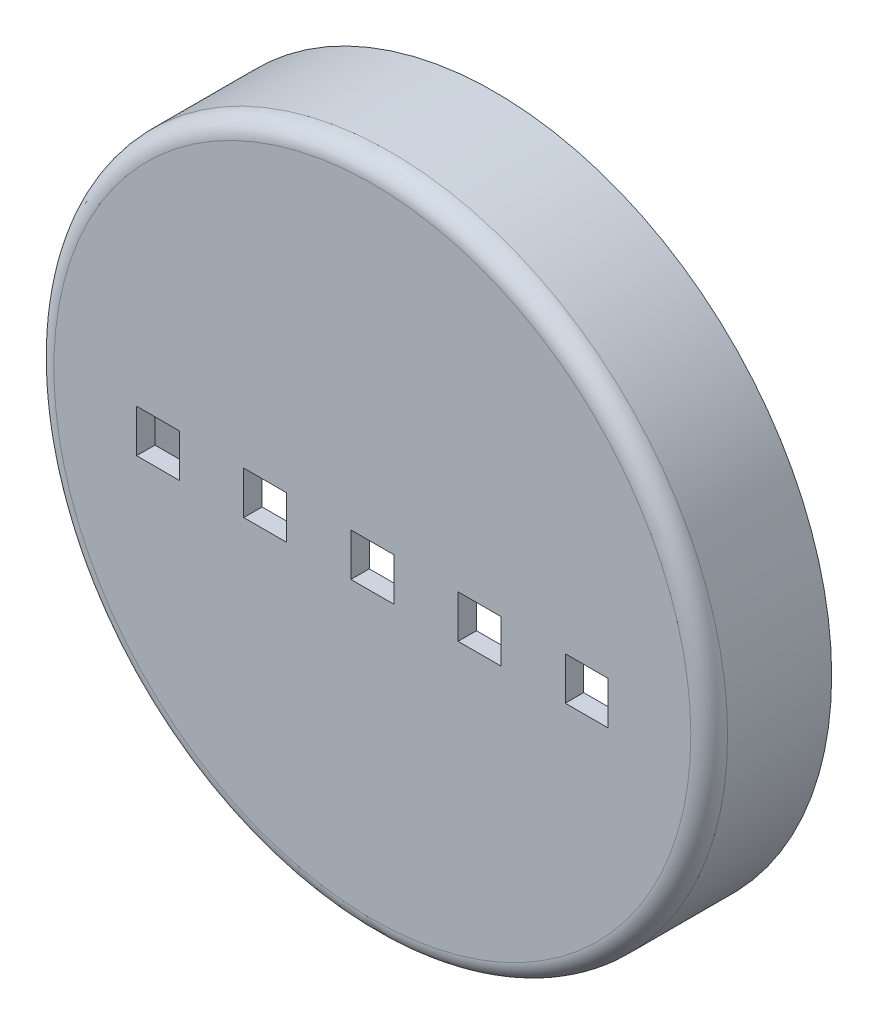
ISO-10303-21;
HEADER;
FILE_DESCRIPTION(('STEP AP214'),'2;1');
FILE_NAME('part.step','',(''),(''),'','','');
FILE_SCHEMA(('AUTOMOTIVE_DESIGN { 1 0 10303 214 1 1 1 1 }'));
ENDSEC;
DATA;
#1=APPLICATION_CONTEXT('core data for automotive mechanical design processes');
#2=APPLICATION_PROTOCOL_DEFINITION('international standard','automotive_design',2000,#1);
#3=PRODUCT_CONTEXT('',#1,'mechanical');
#4=PRODUCT('Part','Part','',(#3));
#5=PRODUCT_RELATED_PRODUCT_CATEGORY('part','',(#4));
#6=PRODUCT_DEFINITION_FORMATION('','',#4);
#7=PRODUCT_DEFINITION_CONTEXT('part definition',#1,'design');
#8=PRODUCT_DEFINITION('design','',#6,#7);
#9=PRODUCT_DEFINITION_SHAPE('','',#8);
#10=(LENGTH_UNIT() NAMED_UNIT(*) SI_UNIT(.MILLI.,.METRE.));
#11=(NAMED_UNIT(*) PLANE_ANGLE_UNIT() SI_UNIT($,.RADIAN.));
#12=(NAMED_UNIT(*) SI_UNIT($,.STERADIAN.) SOLID_ANGLE_UNIT());
#13=UNCERTAINTY_MEASURE_WITH_UNIT(LENGTH_MEASURE(1.E-05),#10,'distance_accuracy_value','');
#14=(GEOMETRIC_REPRESENTATION_CONTEXT(3) GLOBAL_UNCERTAINTY_ASSIGNED_CONTEXT((#13)) GLOBAL_UNIT_ASSIGNED_CONTEXT((#10,
#11,#12)) REPRESENTATION_CONTEXT('',''));
#15=CARTESIAN_POINT('',(0.,0.,0.));
#16=DIRECTION('',(0.,0.,1.));
#17=DIRECTION('',(1.,0.,0.));
#18=AXIS2_PLACEMENT_3D('',#15,#16,#17);
#19=CARTESIAN_POINT('',(328.389379834326,629.271631435778,20.));
#20=DIRECTION('',(0.,0.,1.));
#21=DIRECTION('',(1.,0.,0.));
#22=AXIS2_PLACEMENT_3D('',#19,#20,#21);
#23=PLANE('',#22);
#24=CARTESIAN_POINT('',(328.389379834326,629.271631435778,20.));
#25=DIRECTION('',(0.,0.,1.));
#26=DIRECTION('',(1.,0.,0.));
#27=AXIS2_PLACEMENT_3D('',#24,#25,#26);
#28=CIRCLE('',#27,51.9999999999999);
#29=CARTESIAN_POINT('',(380.389379834326,629.271631435778,20.));
#30=VERTEX_POINT('',#29);
#31=EDGE_CURVE('E72',#30,#30,#28,.T.);
#32=ORIENTED_EDGE('',*,*,#31,.T.);
#33=EDGE_LOOP('',(#32));
#34=FACE_BOUND('',#33,.T.);
#35=DIRECTION('',(0.,1.,0.));
#36=VECTOR('',#35,1.);
#37=CARTESIAN_POINT('',(307.389379834326,629.271631435778,20.));
#38=LINE('',#37,#36);
#39=CARTESIAN_POINT('',(307.389379834326,623.576422512426,20.));
#40=VERTEX_POINT('',#39);
#41=CARTESIAN_POINT('',(307.389379834326,630.576422512426,20.));
#42=VERTEX_POINT('',#41);
#43=EDGE_CURVE('E362',#40,#42,#38,.T.);
#44=ORIENTED_EDGE('',*,*,#43,.T.);
#45=DIRECTION('',(1.,0.,0.));
#46=VECTOR('',#45,1.);
#47=CARTESIAN_POINT('',(328.389379834326,630.576422512426,20.));
#48=LINE('',#47,#46);
#49=CARTESIAN_POINT('',(314.389379834326,630.576422512426,20.));
#50=VERTEX_POINT('',#49);
#51=EDGE_CURVE('E355',#42,#50,#48,.T.);
#52=ORIENTED_EDGE('',*,*,#51,.T.);
#53=DIRECTION('',(0.,1.,0.));
#54=VECTOR('',#53,1.);
#55=CARTESIAN_POINT('',(314.389379834326,629.271631435778,20.));
#56=LINE('',#55,#54);
#57=CARTESIAN_POINT('',(314.389379834326,623.576422512426,20.));
#58=VERTEX_POINT('',#57);
#59=EDGE_CURVE('E359',#58,#50,#56,.T.);
#60=ORIENTED_EDGE('',*,*,#59,.F.);
#61=DIRECTION('',(1.,0.,0.));
#62=VECTOR('',#61,1.);
#63=CARTESIAN_POINT('',(328.389379834326,623.576422512426,20.));
#64=LINE('',#63,#62);
#65=EDGE_CURVE('E234',#40,#58,#64,.T.);
#66=ORIENTED_EDGE('',*,*,#65,.F.);
#67=EDGE_LOOP('',(#44,#52,#60,#66));
#68=FACE_BOUND('',#67,.T.);
#69=DIRECTION('',(1.,0.,0.));
#70=VECTOR('',#69,1.);
#71=CARTESIAN_POINT('',(328.389379834326,623.576422512426,20.));
#72=LINE('',#71,#70);
#73=CARTESIAN_POINT('',(289.889379834326,623.576422512426,20.));
#74=VERTEX_POINT('',#73);
#75=CARTESIAN_POINT('',(296.889379834326,623.576422512426,20.));
#76=VERTEX_POINT('',#75);
#77=EDGE_CURVE('E374',#74,#76,#72,.T.);
#78=ORIENTED_EDGE('',*,*,#77,.F.);
#79=DIRECTION('',(0.,1.,0.));
#80=VECTOR('',#79,1.);
#81=CARTESIAN_POINT('',(289.889379834326,629.271631435778,20.));
#82=LINE('',#81,#80);
#83=CARTESIAN_POINT('',(289.889379834326,630.576422512426,20.));
#84=VERTEX_POINT('',#83);
#85=EDGE_CURVE('E377',#74,#84,#82,.T.);
#86=ORIENTED_EDGE('',*,*,#85,.T.);
#87=DIRECTION('',(1.,0.,0.));
#88=VECTOR('',#87,1.);
#89=CARTESIAN_POINT('',(328.389379834326,630.576422512426,20.));
#90=LINE('',#89,#88);
#91=CARTESIAN_POINT('',(296.889379834326,630.576422512426,20.));
#92=VERTEX_POINT('',#91);
#93=EDGE_CURVE('E366',#84,#92,#90,.T.);
#94=ORIENTED_EDGE('',*,*,#93,.T.);
#95=DIRECTION('',(0.,1.,0.));
#96=VECTOR('',#95,1.);
#97=CARTESIAN_POINT('',(296.889379834326,629.271631435778,20.));
#98=LINE('',#97,#96);
#99=EDGE_CURVE('E370',#76,#92,#98,.T.);
#100=ORIENTED_EDGE('',*,*,#99,.F.);
#101=EDGE_LOOP('',(#78,#86,#94,#100));
#102=FACE_BOUND('',#101,.T.);
#103=DIRECTION('',(1.,0.,0.));
#104=VECTOR('',#103,1.);
#105=CARTESIAN_POINT('',(328.389379834326,623.576422512427,20.));
#106=LINE('',#105,#104);
#107=CARTESIAN_POINT('',(324.889379834326,623.576422512427,20.));
#108=VERTEX_POINT('',#107);
#109=CARTESIAN_POINT('',(331.889379834326,623.576422512427,20.));
#110=VERTEX_POINT('',#109);
#111=EDGE_CURVE('E389',#108,#110,#106,.T.);
#112=ORIENTED_EDGE('',*,*,#111,.F.);
#113=DIRECTION('',(0.,1.,0.));
#114=VECTOR('',#113,1.);
#115=CARTESIAN_POINT('',(324.889379834326,629.271631435778,20.));
#116=LINE('',#115,#114);
#117=CARTESIAN_POINT('',(324.889379834326,630.576422512427,20.));
#118=VERTEX_POINT('',#117);
#119=EDGE_CURVE('E392',#108,#118,#116,.T.);
#120=ORIENTED_EDGE('',*,*,#119,.T.);
#121=DIRECTION('',(1.,0.,0.));
#122=VECTOR('',#121,1.);
#123=CARTESIAN_POINT('',(328.389379834326,630.576422512427,20.));
#124=LINE('',#123,#122);
#125=CARTESIAN_POINT('',(331.889379834326,630.576422512427,20.));
#126=VERTEX_POINT('',#125);
#127=EDGE_CURVE('E381',#118,#126,#124,.T.);
#128=ORIENTED_EDGE('',*,*,#127,.T.);
#129=DIRECTION('',(0.,1.,0.));
#130=VECTOR('',#129,1.);
#131=CARTESIAN_POINT('',(331.889379834326,629.271631435778,20.));
#132=LINE('',#131,#130);
#133=EDGE_CURVE('E385',#110,#126,#132,.T.);
#134=ORIENTED_EDGE('',*,*,#133,.F.);
#135=EDGE_LOOP('',(#112,#120,#128,#134));
#136=FACE_BOUND('',#135,.T.);
#137=DIRECTION('',(1.,0.,0.));
#138=VECTOR('',#137,1.);
#139=CARTESIAN_POINT('',(328.389379834326,623.576422512427,20.));
#140=LINE('',#139,#138);
#141=CARTESIAN_POINT('',(342.389379834326,623.576422512427,20.));
#142=VERTEX_POINT('',#141);
#143=CARTESIAN_POINT('',(349.389379834326,623.576422512427,20.));
#144=VERTEX_POINT('',#143);
#145=EDGE_CURVE('E403',#142,#144,#140,.T.);
#146=ORIENTED_EDGE('',*,*,#145,.F.);
#147=DIRECTION('',(0.,1.,0.));
#148=VECTOR('',#147,1.);
#149=CARTESIAN_POINT('',(342.389379834326,629.271631435778,20.));
#150=LINE('',#149,#148);
#151=CARTESIAN_POINT('',(342.389379834326,630.576422512427,20.));
#152=VERTEX_POINT('',#151);
#153=EDGE_CURVE('E406',#142,#152,#150,.T.);
#154=ORIENTED_EDGE('',*,*,#153,.T.);
#155=DIRECTION('',(1.,0.,0.));
#156=VECTOR('',#155,1.);
#157=CARTESIAN_POINT('',(328.389379834326,630.576422512427,20.));
#158=LINE('',#157,#156);
#159=CARTESIAN_POINT('',(349.389379834326,630.576422512427,20.));
#160=VERTEX_POINT('',#159);
#161=EDGE_CURVE('E396',#152,#160,#158,.T.);
#162=ORIENTED_EDGE('',*,*,#161,.T.);
#163=DIRECTION('',(0.,1.,0.));
#164=VECTOR('',#163,1.);
#165=CARTESIAN_POINT('',(349.389379834326,629.271631435778,20.));
#166=LINE('',#165,#164);
#167=EDGE_CURVE('E400',#144,#160,#166,.T.);
#168=ORIENTED_EDGE('',*,*,#167,.F.);
#169=EDGE_LOOP('',(#146,#154,#162,#168));
#170=FACE_BOUND('',#169,.T.);
#171=DIRECTION('',(1.,0.,0.));
#172=VECTOR('',#171,1.);
#173=CARTESIAN_POINT('',(328.389379834326,623.576422512426,20.));
#174=LINE('',#173,#172);
#175=CARTESIAN_POINT('',(359.889379834326,623.576422512426,20.));
#176=VERTEX_POINT('',#175);
#177=CARTESIAN_POINT('',(366.889379834326,623.576422512426,20.));
#178=VERTEX_POINT('',#177);
#179=EDGE_CURVE('E415',#176,#178,#174,.T.);
#180=ORIENTED_EDGE('',*,*,#179,.F.);
#181=DIRECTION('',(0.,1.,0.));
#182=VECTOR('',#181,1.);
#183=CARTESIAN_POINT('',(359.889379834326,629.271631435778,20.));
#184=LINE('',#183,#182);
#185=CARTESIAN_POINT('',(359.889379834326,630.576422512426,20.));
#186=VERTEX_POINT('',#185);
#187=EDGE_CURVE('E418',#176,#186,#184,.T.);
#188=ORIENTED_EDGE('',*,*,#187,.T.);
#189=DIRECTION('',(1.,0.,0.));
#190=VECTOR('',#189,1.);
#191=CARTESIAN_POINT('',(328.389379834326,630.576422512426,20.));
#192=LINE('',#191,#190);
#193=CARTESIAN_POINT('',(366.889379834326,630.576422512426,20.));
#194=VERTEX_POINT('',#193);
#195=EDGE_CURVE('E410',#186,#194,#192,.T.);
#196=ORIENTED_EDGE('',*,*,#195,.T.);
#197=DIRECTION('',(0.,1.,0.));
#198=VECTOR('',#197,1.);
#199=CARTESIAN_POINT('',(366.889379834326,629.271631435778,20.));
#200=LINE('',#199,#198);
#201=EDGE_CURVE('E206',#178,#194,#200,.T.);
#202=ORIENTED_EDGE('',*,*,#201,.F.);
#203=EDGE_LOOP('',(#180,#188,#196,#202));
#204=FACE_BOUND('',#203,.T.);
#205=ADVANCED_FACE('F63',(#34,#68,#102,#136,#170,#204),#23,.T.);
#206=CARTESIAN_POINT('',(328.628637891029,629.38432064902,17.));
#207=DIRECTION('',(0.,0.,-1.));
#208=DIRECTION('',(-1.,0.,0.));
#209=AXIS2_PLACEMENT_3D('',#206,#207,#208);
#210=PLANE('',#209);
#211=CARTESIAN_POINT('',(282.389379834326,627.076422512427,17.));
#212=DIRECTION('',(0.,0.,-1.));
#213=DIRECTION('',(-1.,0.,0.));
#214=AXIS2_PLACEMENT_3D('',#211,#212,#213);
#215=CIRCLE('',#214,1.50000000000002);
#216=CARTESIAN_POINT('',(280.889379834326,627.076422512427,17.));
#217=VERTEX_POINT('',#216);
#218=EDGE_CURVE('E423',#217,#217,#215,.T.);
#219=ORIENTED_EDGE('',*,*,#218,.F.);
#220=EDGE_LOOP('',(#219));
#221=FACE_BOUND('',#220,.T.);
#222=CARTESIAN_POINT('',(374.389379834326,627.076422512427,17.));
#223=DIRECTION('',(0.,0.,-1.));
#224=DIRECTION('',(-1.,0.,0.));
#225=AXIS2_PLACEMENT_3D('',#222,#223,#224);
#226=CIRCLE('',#225,1.50000000000002);
#227=CARTESIAN_POINT('',(372.889379834326,627.076422512427,17.));
#228=VERTEX_POINT('',#227);
#229=EDGE_CURVE('E427',#228,#228,#226,.T.);
#230=ORIENTED_EDGE('',*,*,#229,.F.);
#231=EDGE_LOOP('',(#230));
#232=FACE_BOUND('',#231,.T.);
#233=CARTESIAN_POINT('',(328.628637891029,629.38432064902,17.));
#234=DIRECTION('',(0.,0.,-1.));
#235=DIRECTION('',(-1.,0.,0.));
#236=AXIS2_PLACEMENT_3D('',#233,#234,#235);
#237=CIRCLE('',#236,51.);
#238=CARTESIAN_POINT('',(277.628637891029,629.38432064902,17.));
#239=VERTEX_POINT('',#238);
#240=EDGE_CURVE('E439',#239,#239,#237,.T.);
#241=ORIENTED_EDGE('',*,*,#240,.T.);
#242=EDGE_LOOP('',(#241));
#243=FACE_BOUND('',#242,.T.);
#244=DIRECTION('',(0.,-1.,0.));
#245=VECTOR('',#244,1.);
#246=CARTESIAN_POINT('',(314.389379834326,630.576422512426,17.));
#247=LINE('',#246,#245);
#248=CARTESIAN_POINT('',(314.389379834326,630.576422512426,17.));
#249=VERTEX_POINT('',#248);
#250=CARTESIAN_POINT('',(314.389379834326,623.576422512426,17.));
#251=VERTEX_POINT('',#250);
#252=EDGE_CURVE('E311',#249,#251,#247,.T.);
#253=ORIENTED_EDGE('',*,*,#252,.F.);
#254=DIRECTION('',(-1.,0.,0.));
#255=VECTOR('',#254,1.);
#256=CARTESIAN_POINT('',(0.,630.576422512426,17.));
#257=LINE('',#256,#255);
#258=CARTESIAN_POINT('',(307.389379834326,630.576422512426,17.));
#259=VERTEX_POINT('',#258);
#260=EDGE_CURVE('E334',#249,#259,#257,.T.);
#261=ORIENTED_EDGE('',*,*,#260,.T.);
#262=DIRECTION('',(0.,-1.,0.));
#263=VECTOR('',#262,1.);
#264=CARTESIAN_POINT('',(307.389379834326,630.576422512426,17.));
#265=LINE('',#264,#263);
#266=CARTESIAN_POINT('',(307.389379834326,623.576422512426,17.));
#267=VERTEX_POINT('',#266);
#268=EDGE_CURVE('E330',#259,#267,#265,.T.);
#269=ORIENTED_EDGE('',*,*,#268,.T.);
#270=DIRECTION('',(-1.,0.,0.));
#271=VECTOR('',#270,1.);
#272=CARTESIAN_POINT('',(314.389379834326,623.576422512426,17.));
#273=LINE('',#272,#271);
#274=EDGE_CURVE('E338',#251,#267,#273,.T.);
#275=ORIENTED_EDGE('',*,*,#274,.F.);
#276=EDGE_LOOP('',(#253,#261,#269,#275));
#277=FACE_BOUND('',#276,.T.);
#278=DIRECTION('',(-1.,0.,0.));
#279=VECTOR('',#278,1.);
#280=CARTESIAN_POINT('',(0.,630.576422512426,17.));
#281=LINE('',#280,#279);
#282=CARTESIAN_POINT('',(296.889379834326,630.576422512426,17.));
#283=VERTEX_POINT('',#282);
#284=CARTESIAN_POINT('',(289.889379834326,630.576422512426,17.));
#285=VERTEX_POINT('',#284);
#286=EDGE_CURVE('E319',#283,#285,#281,.T.);
#287=ORIENTED_EDGE('',*,*,#286,.T.);
#288=DIRECTION('',(0.,-1.,0.));
#289=VECTOR('',#288,1.);
#290=CARTESIAN_POINT('',(289.889379834326,0.,17.));
#291=LINE('',#290,#289);
#292=CARTESIAN_POINT('',(289.889379834326,623.576422512426,17.));
#293=VERTEX_POINT('',#292);
#294=EDGE_CURVE('E282',#285,#293,#291,.T.);
#295=ORIENTED_EDGE('',*,*,#294,.T.);
#296=DIRECTION('',(-1.,0.,0.));
#297=VECTOR('',#296,1.);
#298=CARTESIAN_POINT('',(0.,623.576422512426,17.));
#299=LINE('',#298,#297);
#300=CARTESIAN_POINT('',(296.889379834326,623.576422512426,17.));
#301=VERTEX_POINT('',#300);
#302=EDGE_CURVE('E301',#301,#293,#299,.T.);
#303=ORIENTED_EDGE('',*,*,#302,.F.);
#304=DIRECTION('',(0.,-1.,0.));
#305=VECTOR('',#304,1.);
#306=CARTESIAN_POINT('',(296.889379834326,0.,17.));
#307=LINE('',#306,#305);
#308=EDGE_CURVE('E315',#283,#301,#307,.T.);
#309=ORIENTED_EDGE('',*,*,#308,.F.);
#310=EDGE_LOOP('',(#287,#295,#303,#309));
#311=FACE_BOUND('',#310,.T.);
#312=DIRECTION('',(-1.,0.,0.));
#313=VECTOR('',#312,1.);
#314=CARTESIAN_POINT('',(0.,630.576422512427,17.));
#315=LINE('',#314,#313);
#316=CARTESIAN_POINT('',(331.889379834326,630.576422512427,17.));
#317=VERTEX_POINT('',#316);
#318=CARTESIAN_POINT('',(324.889379834326,630.576422512427,17.));
#319=VERTEX_POINT('',#318);
#320=EDGE_CURVE('E290',#317,#319,#315,.T.);
#321=ORIENTED_EDGE('',*,*,#320,.T.);
#322=DIRECTION('',(0.,-1.,0.));
#323=VECTOR('',#322,1.);
#324=CARTESIAN_POINT('',(324.889379834326,0.,17.));
#325=LINE('',#324,#323);
#326=CARTESIAN_POINT('',(324.889379834326,623.576422512427,17.));
#327=VERTEX_POINT('',#326);
#328=EDGE_CURVE('E252',#319,#327,#325,.T.);
#329=ORIENTED_EDGE('',*,*,#328,.T.);
#330=DIRECTION('',(-1.,0.,0.));
#331=VECTOR('',#330,1.);
#332=CARTESIAN_POINT('',(0.,623.576422512427,17.));
#333=LINE('',#332,#331);
#334=CARTESIAN_POINT('',(331.889379834326,623.576422512427,17.));
#335=VERTEX_POINT('',#334);
#336=EDGE_CURVE('E272',#335,#327,#333,.T.);
#337=ORIENTED_EDGE('',*,*,#336,.F.);
#338=DIRECTION('',(0.,-1.,0.));
#339=VECTOR('',#338,1.);
#340=CARTESIAN_POINT('',(331.889379834326,0.,17.));
#341=LINE('',#340,#339);
#342=EDGE_CURVE('E286',#317,#335,#341,.T.);
#343=ORIENTED_EDGE('',*,*,#342,.F.);
#344=EDGE_LOOP('',(#321,#329,#337,#343));
#345=FACE_BOUND('',#344,.T.);
#346=DIRECTION('',(-1.,0.,0.));
#347=VECTOR('',#346,1.);
#348=CARTESIAN_POINT('',(0.,630.576422512427,17.));
#349=LINE('',#348,#347);
#350=CARTESIAN_POINT('',(349.389379834326,630.576422512427,17.));
#351=VERTEX_POINT('',#350);
#352=CARTESIAN_POINT('',(342.389379834326,630.576422512427,17.));
#353=VERTEX_POINT('',#352);
#354=EDGE_CURVE('E260',#351,#353,#349,.T.);
#355=ORIENTED_EDGE('',*,*,#354,.T.);
#356=DIRECTION('',(0.,-1.,0.));
#357=VECTOR('',#356,1.);
#358=CARTESIAN_POINT('',(342.389379834326,0.,17.));
#359=LINE('',#358,#357);
#360=CARTESIAN_POINT('',(342.389379834326,623.576422512427,17.));
#361=VERTEX_POINT('',#360);
#362=EDGE_CURVE('E264',#353,#361,#359,.T.);
#363=ORIENTED_EDGE('',*,*,#362,.T.);
#364=DIRECTION('',(-1.,0.,0.));
#365=VECTOR('',#364,1.);
#366=CARTESIAN_POINT('',(0.,623.576422512427,17.));
#367=LINE('',#366,#365);
#368=CARTESIAN_POINT('',(349.389379834326,623.576422512427,17.));
#369=VERTEX_POINT('',#368);
#370=EDGE_CURVE('E243',#369,#361,#367,.T.);
#371=ORIENTED_EDGE('',*,*,#370,.F.);
#372=DIRECTION('',(0.,-1.,0.));
#373=VECTOR('',#372,1.);
#374=CARTESIAN_POINT('',(349.389379834326,0.,17.));
#375=LINE('',#374,#373);
#376=EDGE_CURVE('E256',#351,#369,#375,.T.);
#377=ORIENTED_EDGE('',*,*,#376,.F.);
#378=EDGE_LOOP('',(#355,#363,#371,#377));
#379=FACE_BOUND('',#378,.T.);
#380=DIRECTION('',(-1.,0.,0.));
#381=VECTOR('',#380,1.);
#382=CARTESIAN_POINT('',(0.,630.576422512426,17.));
#383=LINE('',#382,#381);
#384=CARTESIAN_POINT('',(366.889379834326,630.576422512426,17.));
#385=VERTEX_POINT('',#384);
#386=CARTESIAN_POINT('',(359.889379834326,630.576422512426,17.));
#387=VERTEX_POINT('',#386);
#388=EDGE_CURVE('E214',#385,#387,#383,.T.);
#389=ORIENTED_EDGE('',*,*,#388,.T.);
#390=DIRECTION('',(0.,-1.,0.));
#391=VECTOR('',#390,1.);
#392=CARTESIAN_POINT('',(359.889379834326,0.,17.));
#393=LINE('',#392,#391);
#394=CARTESIAN_POINT('',(359.889379834326,623.576422512426,17.));
#395=VERTEX_POINT('',#394);
#396=EDGE_CURVE('E220',#387,#395,#393,.T.);
#397=ORIENTED_EDGE('',*,*,#396,.T.);
#398=DIRECTION('',(-1.,0.,0.));
#399=VECTOR('',#398,1.);
#400=CARTESIAN_POINT('',(0.,623.576422512426,17.));
#401=LINE('',#400,#399);
#402=CARTESIAN_POINT('',(366.889379834326,623.576422512426,17.));
#403=VERTEX_POINT('',#402);
#404=EDGE_CURVE('E224',#403,#395,#401,.T.);
#405=ORIENTED_EDGE('',*,*,#404,.F.);
#406=DIRECTION('',(0.,-1.,0.));
#407=VECTOR('',#406,1.);
#408=CARTESIAN_POINT('',(366.889379834326,0.,17.));
#409=LINE('',#408,#407);
#410=EDGE_CURVE('E203',#385,#403,#409,.T.);
#411=ORIENTED_EDGE('',*,*,#410,.F.);
#412=EDGE_LOOP('',(#389,#397,#405,#411));
#413=FACE_BOUND('',#412,.T.);
#414=ADVANCED_FACE('F222',(#221,#232,#243,#277,#311,#345,#379,#413),#210,.T.);
#415=CARTESIAN_POINT('',(328.389379834326,629.271631435778,20.));
#416=DIRECTION('',(0.,0.,-1.));
#417=DIRECTION('',(-1.,0.,0.));
#418=AXIS2_PLACEMENT_3D('',#415,#416,#417);
#419=CYLINDRICAL_SURFACE('',#418,54.9999999999999);
#420=CARTESIAN_POINT('',(328.389379834326,629.271631435778,17.));
#421=DIRECTION('',(0.,0.,1.));
#422=DIRECTION('',(1.,0.,0.));
#423=AXIS2_PLACEMENT_3D('',#420,#421,#422);
#424=CIRCLE('',#423,54.9999999999999);
#425=CARTESIAN_POINT('',(383.389379834326,629.271631435778,17.));
#426=VERTEX_POINT('',#425);
#427=EDGE_CURVE('E12',#426,#426,#424,.F.);
#428=ORIENTED_EDGE('',*,*,#427,.T.);
#429=EDGE_LOOP('',(#428));
#430=FACE_BOUND('',#429,.T.);
#431=CARTESIAN_POINT('',(328.389379834326,629.271631435778,0.));
#432=DIRECTION('',(0.,0.,1.));
#433=DIRECTION('',(1.,0.,0.));
#434=AXIS2_PLACEMENT_3D('',#431,#432,#433);
#435=CIRCLE('',#434,54.9999999999999);
#436=CARTESIAN_POINT('',(383.389379834326,629.271631435778,0.));
#437=VERTEX_POINT('',#436);
#438=EDGE_CURVE('E443',#437,#437,#435,.T.);
#439=ORIENTED_EDGE('',*,*,#438,.T.);
#440=EDGE_LOOP('',(#439));
#441=FACE_BOUND('',#440,.T.);
#442=ADVANCED_FACE('F467',(#430,#441),#419,.T.);
#443=CARTESIAN_POINT('',(328.389379834326,629.271631435778,0.));
#444=DIRECTION('',(0.,0.,1.));
#445=DIRECTION('',(1.,0.,0.));
#446=AXIS2_PLACEMENT_3D('',#443,#444,#445);
#447=PLANE('',#446);
#448=CARTESIAN_POINT('',(328.628637891029,629.38432064902,0.));
#449=DIRECTION('',(0.,0.,-1.));
#450=DIRECTION('',(-1.,0.,0.));
#451=AXIS2_PLACEMENT_3D('',#448,#449,#450);
#452=CIRCLE('',#451,51.);
#453=CARTESIAN_POINT('',(277.628637891029,629.38432064902,0.));
#454=VERTEX_POINT('',#453);
#455=EDGE_CURVE('E435',#454,#454,#452,.T.);
#456=ORIENTED_EDGE('',*,*,#455,.F.);
#457=EDGE_LOOP('',(#456));
#458=FACE_BOUND('',#457,.T.);
#459=ORIENTED_EDGE('',*,*,#438,.F.);
#460=EDGE_LOOP('',(#459));
#461=FACE_BOUND('',#460,.T.);
#462=ADVANCED_FACE('F473',(#458,#461),#447,.F.);
#463=CARTESIAN_POINT('',(328.628637891029,629.38432064902,17.));
#464=DIRECTION('',(0.,0.,-1.));
#465=DIRECTION('',(-1.,0.,0.));
#466=AXIS2_PLACEMENT_3D('',#463,#464,#465);
#467=CYLINDRICAL_SURFACE('',#466,51.);
#468=ORIENTED_EDGE('',*,*,#240,.F.);
#469=EDGE_LOOP('',(#468));
#470=FACE_BOUND('',#469,.T.);
#471=ORIENTED_EDGE('',*,*,#455,.T.);
#472=EDGE_LOOP('',(#471));
#473=FACE_BOUND('',#472,.T.);
#474=ADVANCED_FACE('F472',(#470,#473),#467,.F.);
#475=CARTESIAN_POINT('',(374.389379834326,627.076422512427,7.));
#476=DIRECTION('',(0.,0.,1.));
#477=DIRECTION('',(1.,0.,0.));
#478=AXIS2_PLACEMENT_3D('',#475,#476,#477);
#479=CYLINDRICAL_SURFACE('',#478,1.50000000000002);
#480=CARTESIAN_POINT('',(374.389379834326,627.076422512427,7.));
#481=DIRECTION('',(0.,0.,-1.));
#482=DIRECTION('',(-1.,0.,0.));
#483=AXIS2_PLACEMENT_3D('',#480,#481,#482);
#484=CIRCLE('',#483,1.50000000000002);
#485=CARTESIAN_POINT('',(372.889379834326,627.076422512427,7.));
#486=VERTEX_POINT('',#485);
#487=EDGE_CURVE('E431',#486,#486,#484,.T.);
#488=ORIENTED_EDGE('',*,*,#487,.F.);
#489=EDGE_LOOP('',(#488));
#490=FACE_BOUND('',#489,.T.);
#491=ORIENTED_EDGE('',*,*,#229,.T.);
#492=EDGE_LOOP('',(#491));
#493=FACE_BOUND('',#492,.T.);
#494=ADVANCED_FACE('F495',(#490,#493),#479,.T.);
#495=CARTESIAN_POINT('',(374.389379834326,627.076422512427,7.));
#496=DIRECTION('',(0.,0.,-1.));
#497=DIRECTION('',(-1.,0.,0.));
#498=AXIS2_PLACEMENT_3D('',#495,#496,#497);
#499=PLANE('',#498);
#500=ORIENTED_EDGE('',*,*,#487,.T.);
#501=EDGE_LOOP('',(#500));
#502=FACE_BOUND('',#501,.T.);
#503=ADVANCED_FACE('F502',(#502),#499,.T.);
#504=CARTESIAN_POINT('',(282.389379834326,627.076422512427,7.));
#505=DIRECTION('',(0.,0.,1.));
#506=DIRECTION('',(1.,0.,0.));
#507=AXIS2_PLACEMENT_3D('',#504,#505,#506);
#508=CYLINDRICAL_SURFACE('',#507,1.50000000000002);
#509=CARTESIAN_POINT('',(282.389379834326,627.076422512427,7.));
#510=DIRECTION('',(0.,0.,-1.));
#511=DIRECTION('',(-1.,0.,0.));
#512=AXIS2_PLACEMENT_3D('',#509,#510,#511);
#513=CIRCLE('',#512,1.50000000000002);
#514=CARTESIAN_POINT('',(280.889379834326,627.076422512427,7.));
#515=VERTEX_POINT('',#514);
#516=EDGE_CURVE('E422',#515,#515,#513,.T.);
#517=ORIENTED_EDGE('',*,*,#516,.F.);
#518=EDGE_LOOP('',(#517));
#519=FACE_BOUND('',#518,.T.);
#520=ORIENTED_EDGE('',*,*,#218,.T.);
#521=EDGE_LOOP('',(#520));
#522=FACE_BOUND('',#521,.T.);
#523=ADVANCED_FACE('F510',(#519,#522),#508,.T.);
#524=CARTESIAN_POINT('',(282.389379834326,627.076422512427,7.));
#525=DIRECTION('',(0.,0.,-1.));
#526=DIRECTION('',(-1.,0.,0.));
#527=AXIS2_PLACEMENT_3D('',#524,#525,#526);
#528=PLANE('',#527);
#529=ORIENTED_EDGE('',*,*,#516,.T.);
#530=EDGE_LOOP('',(#529));
#531=FACE_BOUND('',#530,.T.);
#532=ADVANCED_FACE('F518',(#531),#528,.T.);
#533=CARTESIAN_POINT('',(307.389379834326,0.,27.));
#534=DIRECTION('',(1.,0.,0.));
#535=DIRECTION('',(0.,0.,-1.));
#536=AXIS2_PLACEMENT_3D('',#533,#534,#535);
#537=PLANE('',#536);
#538=DIRECTION('',(0.,0.,-1.));
#539=VECTOR('',#538,1.);
#540=CARTESIAN_POINT('',(307.389379834326,623.576422512426,27.));
#541=LINE('',#540,#539);
#542=EDGE_CURVE('E331',#40,#267,#541,.T.);
#543=ORIENTED_EDGE('',*,*,#542,.T.);
#544=ORIENTED_EDGE('',*,*,#268,.F.);
#545=DIRECTION('',(0.,0.,-1.));
#546=VECTOR('',#545,1.);
#547=CARTESIAN_POINT('',(307.389379834326,630.576422512426,27.));
#548=LINE('',#547,#546);
#549=EDGE_CURVE('E344',#42,#259,#548,.T.);
#550=ORIENTED_EDGE('',*,*,#549,.F.);
#551=ORIENTED_EDGE('',*,*,#43,.F.);
#552=EDGE_LOOP('',(#543,#544,#550,#551));
#553=FACE_BOUND('',#552,.T.);
#554=ADVANCED_FACE('F526',(#553),#537,.T.);
#555=CARTESIAN_POINT('',(314.389379834326,0.,27.));
#556=DIRECTION('',(1.,0.,0.));
#557=DIRECTION('',(0.,0.,-1.));
#558=AXIS2_PLACEMENT_3D('',#555,#556,#557);
#559=PLANE('',#558);
#560=ORIENTED_EDGE('',*,*,#59,.T.);
#561=DIRECTION('',(0.,0.,-1.));
#562=VECTOR('',#561,1.);
#563=CARTESIAN_POINT('',(314.389379834326,630.576422512426,27.));
#564=LINE('',#563,#562);
#565=EDGE_CURVE('E347',#50,#249,#564,.T.);
#566=ORIENTED_EDGE('',*,*,#565,.T.);
#567=ORIENTED_EDGE('',*,*,#252,.T.);
#568=DIRECTION('',(0.,0.,-1.));
#569=VECTOR('',#568,1.);
#570=CARTESIAN_POINT('',(314.389379834326,623.576422512426,27.));
#571=LINE('',#570,#569);
#572=EDGE_CURVE('E326',#58,#251,#571,.T.);
#573=ORIENTED_EDGE('',*,*,#572,.F.);
#574=EDGE_LOOP('',(#560,#566,#567,#573));
#575=FACE_BOUND('',#574,.T.);
#576=ADVANCED_FACE('F534',(#575),#559,.F.);
#577=CARTESIAN_POINT('',(0.,630.576422512426,27.));
#578=DIRECTION('',(0.,-1.,0.));
#579=DIRECTION('',(0.,0.,-1.));
#580=AXIS2_PLACEMENT_3D('',#577,#578,#579);
#581=PLANE('',#580);
#582=ORIENTED_EDGE('',*,*,#549,.T.);
#583=ORIENTED_EDGE('',*,*,#260,.F.);
#584=ORIENTED_EDGE('',*,*,#565,.F.);
#585=ORIENTED_EDGE('',*,*,#51,.F.);
#586=EDGE_LOOP('',(#582,#583,#584,#585));
#587=FACE_BOUND('',#586,.T.);
#588=ADVANCED_FACE('F542',(#587),#581,.T.);
#589=CARTESIAN_POINT('',(314.389379834326,623.576422512426,27.));
#590=DIRECTION('',(0.,-1.,0.));
#591=DIRECTION('',(0.,0.,-1.));
#592=AXIS2_PLACEMENT_3D('',#589,#590,#591);
#593=PLANE('',#592);
#594=ORIENTED_EDGE('',*,*,#65,.T.);
#595=ORIENTED_EDGE('',*,*,#572,.T.);
#596=ORIENTED_EDGE('',*,*,#274,.T.);
#597=ORIENTED_EDGE('',*,*,#542,.F.);
#598=EDGE_LOOP('',(#594,#595,#596,#597));
#599=FACE_BOUND('',#598,.T.);
#600=ADVANCED_FACE('F545',(#599),#593,.F.);
#601=CARTESIAN_POINT('',(289.889379834326,0.,27.));
#602=DIRECTION('',(1.,0.,0.));
#603=DIRECTION('',(0.,0.,-1.));
#604=AXIS2_PLACEMENT_3D('',#601,#602,#603);
#605=PLANE('',#604);
#606=DIRECTION('',(0.,0.,-1.));
#607=VECTOR('',#606,1.);
#608=CARTESIAN_POINT('',(289.889379834326,623.576422512426,27.));
#609=LINE('',#608,#607);
#610=EDGE_CURVE('E308',#74,#293,#609,.T.);
#611=ORIENTED_EDGE('',*,*,#610,.T.);
#612=ORIENTED_EDGE('',*,*,#294,.F.);
#613=DIRECTION('',(0.,0.,-1.));
#614=VECTOR('',#613,1.);
#615=CARTESIAN_POINT('',(289.889379834326,630.576422512426,27.));
#616=LINE('',#615,#614);
#617=EDGE_CURVE('E297',#84,#285,#616,.T.);
#618=ORIENTED_EDGE('',*,*,#617,.F.);
#619=ORIENTED_EDGE('',*,*,#85,.F.);
#620=EDGE_LOOP('',(#611,#612,#618,#619));
#621=FACE_BOUND('',#620,.T.);
#622=ADVANCED_FACE('F553',(#621),#605,.T.);
#623=CARTESIAN_POINT('',(0.,623.576422512426,27.));
#624=DIRECTION('',(0.,-1.,0.));
#625=DIRECTION('',(0.,0.,-1.));
#626=AXIS2_PLACEMENT_3D('',#623,#624,#625);
#627=PLANE('',#626);
#628=ORIENTED_EDGE('',*,*,#77,.T.);
#629=DIRECTION('',(0.,0.,-1.));
#630=VECTOR('',#629,1.);
#631=CARTESIAN_POINT('',(296.889379834326,623.576422512426,27.));
#632=LINE('',#631,#630);
#633=EDGE_CURVE('E305',#76,#301,#632,.T.);
#634=ORIENTED_EDGE('',*,*,#633,.T.);
#635=ORIENTED_EDGE('',*,*,#302,.T.);
#636=ORIENTED_EDGE('',*,*,#610,.F.);
#637=EDGE_LOOP('',(#628,#634,#635,#636));
#638=FACE_BOUND('',#637,.T.);
#639=ADVANCED_FACE('F566',(#638),#627,.F.);
#640=CARTESIAN_POINT('',(296.889379834326,0.,27.));
#641=DIRECTION('',(1.,0.,0.));
#642=DIRECTION('',(0.,0.,-1.));
#643=AXIS2_PLACEMENT_3D('',#640,#641,#642);
#644=PLANE('',#643);
#645=ORIENTED_EDGE('',*,*,#99,.T.);
#646=DIRECTION('',(0.,0.,-1.));
#647=VECTOR('',#646,1.);
#648=CARTESIAN_POINT('',(296.889379834326,630.576422512426,27.));
#649=LINE('',#648,#647);
#650=EDGE_CURVE('E302',#92,#283,#649,.T.);
#651=ORIENTED_EDGE('',*,*,#650,.T.);
#652=ORIENTED_EDGE('',*,*,#308,.T.);
#653=ORIENTED_EDGE('',*,*,#633,.F.);
#654=EDGE_LOOP('',(#645,#651,#652,#653));
#655=FACE_BOUND('',#654,.T.);
#656=ADVANCED_FACE('F574',(#655),#644,.F.);
#657=CARTESIAN_POINT('',(0.,630.576422512426,27.));
#658=DIRECTION('',(0.,-1.,0.));
#659=DIRECTION('',(0.,0.,-1.));
#660=AXIS2_PLACEMENT_3D('',#657,#658,#659);
#661=PLANE('',#660);
#662=ORIENTED_EDGE('',*,*,#617,.T.);
#663=ORIENTED_EDGE('',*,*,#286,.F.);
#664=ORIENTED_EDGE('',*,*,#650,.F.);
#665=ORIENTED_EDGE('',*,*,#93,.F.);
#666=EDGE_LOOP('',(#662,#663,#664,#665));
#667=FACE_BOUND('',#666,.T.);
#668=ADVANCED_FACE('F582',(#667),#661,.T.);
#669=CARTESIAN_POINT('',(324.889379834326,0.,27.));
#670=DIRECTION('',(1.,0.,0.));
#671=DIRECTION('',(0.,0.,-1.));
#672=AXIS2_PLACEMENT_3D('',#669,#670,#671);
#673=PLANE('',#672);
#674=DIRECTION('',(0.,0.,-1.));
#675=VECTOR('',#674,1.);
#676=CARTESIAN_POINT('',(324.889379834326,623.576422512427,27.));
#677=LINE('',#676,#675);
#678=EDGE_CURVE('E279',#108,#327,#677,.T.);
#679=ORIENTED_EDGE('',*,*,#678,.T.);
#680=ORIENTED_EDGE('',*,*,#328,.F.);
#681=DIRECTION('',(0.,0.,-1.));
#682=VECTOR('',#681,1.);
#683=CARTESIAN_POINT('',(324.889379834326,630.576422512427,27.));
#684=LINE('',#683,#682);
#685=EDGE_CURVE('E268',#118,#319,#684,.T.);
#686=ORIENTED_EDGE('',*,*,#685,.F.);
#687=ORIENTED_EDGE('',*,*,#119,.F.);
#688=EDGE_LOOP('',(#679,#680,#686,#687));
#689=FACE_BOUND('',#688,.T.);
#690=ADVANCED_FACE('F590',(#689),#673,.T.);
#691=CARTESIAN_POINT('',(0.,623.576422512427,27.));
#692=DIRECTION('',(0.,-1.,0.));
#693=DIRECTION('',(0.,0.,-1.));
#694=AXIS2_PLACEMENT_3D('',#691,#692,#693);
#695=PLANE('',#694);
#696=ORIENTED_EDGE('',*,*,#111,.T.);
#697=DIRECTION('',(0.,0.,-1.));
#698=VECTOR('',#697,1.);
#699=CARTESIAN_POINT('',(331.889379834326,623.576422512427,27.));
#700=LINE('',#699,#698);
#701=EDGE_CURVE('E276',#110,#335,#700,.T.);
#702=ORIENTED_EDGE('',*,*,#701,.T.);
#703=ORIENTED_EDGE('',*,*,#336,.T.);
#704=ORIENTED_EDGE('',*,*,#678,.F.);
#705=EDGE_LOOP('',(#696,#702,#703,#704));
#706=FACE_BOUND('',#705,.T.);
#707=ADVANCED_FACE('F598',(#706),#695,.F.);
#708=CARTESIAN_POINT('',(331.889379834326,0.,27.));
#709=DIRECTION('',(1.,0.,0.));
#710=DIRECTION('',(0.,0.,-1.));
#711=AXIS2_PLACEMENT_3D('',#708,#709,#710);
#712=PLANE('',#711);
#713=ORIENTED_EDGE('',*,*,#133,.T.);
#714=DIRECTION('',(0.,0.,-1.));
#715=VECTOR('',#714,1.);
#716=CARTESIAN_POINT('',(331.889379834326,630.576422512427,27.));
#717=LINE('',#716,#715);
#718=EDGE_CURVE('E273',#126,#317,#717,.T.);
#719=ORIENTED_EDGE('',*,*,#718,.T.);
#720=ORIENTED_EDGE('',*,*,#342,.T.);
#721=ORIENTED_EDGE('',*,*,#701,.F.);
#722=EDGE_LOOP('',(#713,#719,#720,#721));
#723=FACE_BOUND('',#722,.T.);
#724=ADVANCED_FACE('F606',(#723),#712,.F.);
#725=CARTESIAN_POINT('',(0.,630.576422512427,27.));
#726=DIRECTION('',(0.,-1.,0.));
#727=DIRECTION('',(0.,0.,-1.));
#728=AXIS2_PLACEMENT_3D('',#725,#726,#727);
#729=PLANE('',#728);
#730=ORIENTED_EDGE('',*,*,#685,.T.);
#731=ORIENTED_EDGE('',*,*,#320,.F.);
#732=ORIENTED_EDGE('',*,*,#718,.F.);
#733=ORIENTED_EDGE('',*,*,#127,.F.);
#734=EDGE_LOOP('',(#730,#731,#732,#733));
#735=FACE_BOUND('',#734,.T.);
#736=ADVANCED_FACE('F614',(#735),#729,.T.);
#737=CARTESIAN_POINT('',(342.389379834326,0.,27.));
#738=DIRECTION('',(1.,0.,0.));
#739=DIRECTION('',(0.,0.,-1.));
#740=AXIS2_PLACEMENT_3D('',#737,#738,#739);
#741=PLANE('',#740);
#742=DIRECTION('',(0.,0.,-1.));
#743=VECTOR('',#742,1.);
#744=CARTESIAN_POINT('',(342.389379834326,623.576422512427,27.));
#745=LINE('',#744,#743);
#746=EDGE_CURVE('E249',#142,#361,#745,.T.);
#747=ORIENTED_EDGE('',*,*,#746,.T.);
#748=ORIENTED_EDGE('',*,*,#362,.F.);
#749=DIRECTION('',(0.,0.,-1.));
#750=VECTOR('',#749,1.);
#751=CARTESIAN_POINT('',(342.389379834326,630.576422512427,27.));
#752=LINE('',#751,#750);
#753=EDGE_CURVE('E239',#152,#353,#752,.T.);
#754=ORIENTED_EDGE('',*,*,#753,.F.);
#755=ORIENTED_EDGE('',*,*,#153,.F.);
#756=EDGE_LOOP('',(#747,#748,#754,#755));
#757=FACE_BOUND('',#756,.T.);
#758=ADVANCED_FACE('F622',(#757),#741,.T.);
#759=CARTESIAN_POINT('',(0.,623.576422512427,27.));
#760=DIRECTION('',(0.,-1.,0.));
#761=DIRECTION('',(0.,0.,-1.));
#762=AXIS2_PLACEMENT_3D('',#759,#760,#761);
#763=PLANE('',#762);
#764=ORIENTED_EDGE('',*,*,#145,.T.);
#765=DIRECTION('',(0.,0.,-1.));
#766=VECTOR('',#765,1.);
#767=CARTESIAN_POINT('',(349.389379834326,623.576422512427,27.));
#768=LINE('',#767,#766);
#769=EDGE_CURVE('E246',#144,#369,#768,.T.);
#770=ORIENTED_EDGE('',*,*,#769,.T.);
#771=ORIENTED_EDGE('',*,*,#370,.T.);
#772=ORIENTED_EDGE('',*,*,#746,.F.);
#773=EDGE_LOOP('',(#764,#770,#771,#772));
#774=FACE_BOUND('',#773,.T.);
#775=ADVANCED_FACE('F630',(#774),#763,.F.);
#776=CARTESIAN_POINT('',(349.389379834326,0.,27.));
#777=DIRECTION('',(1.,0.,0.));
#778=DIRECTION('',(0.,0.,-1.));
#779=AXIS2_PLACEMENT_3D('',#776,#777,#778);
#780=PLANE('',#779);
#781=ORIENTED_EDGE('',*,*,#167,.T.);
#782=DIRECTION('',(0.,0.,-1.));
#783=VECTOR('',#782,1.);
#784=CARTESIAN_POINT('',(349.389379834326,630.576422512427,27.));
#785=LINE('',#784,#783);
#786=EDGE_CURVE('E87',#160,#351,#785,.T.);
#787=ORIENTED_EDGE('',*,*,#786,.T.);
#788=ORIENTED_EDGE('',*,*,#376,.T.);
#789=ORIENTED_EDGE('',*,*,#769,.F.);
#790=EDGE_LOOP('',(#781,#787,#788,#789));
#791=FACE_BOUND('',#790,.T.);
#792=ADVANCED_FACE('F638',(#791),#780,.F.);
#793=CARTESIAN_POINT('',(0.,630.576422512427,27.));
#794=DIRECTION('',(0.,-1.,0.));
#795=DIRECTION('',(0.,0.,-1.));
#796=AXIS2_PLACEMENT_3D('',#793,#794,#795);
#797=PLANE('',#796);
#798=ORIENTED_EDGE('',*,*,#753,.T.);
#799=ORIENTED_EDGE('',*,*,#354,.F.);
#800=ORIENTED_EDGE('',*,*,#786,.F.);
#801=ORIENTED_EDGE('',*,*,#161,.F.);
#802=EDGE_LOOP('',(#798,#799,#800,#801));
#803=FACE_BOUND('',#802,.T.);
#804=ADVANCED_FACE('F646',(#803),#797,.T.);
#805=CARTESIAN_POINT('',(359.889379834326,0.,27.));
#806=DIRECTION('',(1.,0.,0.));
#807=DIRECTION('',(0.,0.,-1.));
#808=AXIS2_PLACEMENT_3D('',#805,#806,#807);
#809=PLANE('',#808);
#810=DIRECTION('',(0.,0.,-1.));
#811=VECTOR('',#810,1.);
#812=CARTESIAN_POINT('',(359.889379834326,623.576422512426,27.));
#813=LINE('',#812,#811);
#814=EDGE_CURVE('E231',#176,#395,#813,.T.);
#815=ORIENTED_EDGE('',*,*,#814,.T.);
#816=ORIENTED_EDGE('',*,*,#396,.F.);
#817=DIRECTION('',(0.,0.,-1.));
#818=VECTOR('',#817,1.);
#819=CARTESIAN_POINT('',(359.889379834326,630.576422512426,27.));
#820=LINE('',#819,#818);
#821=EDGE_CURVE('E210',#186,#387,#820,.T.);
#822=ORIENTED_EDGE('',*,*,#821,.F.);
#823=ORIENTED_EDGE('',*,*,#187,.F.);
#824=EDGE_LOOP('',(#815,#816,#822,#823));
#825=FACE_BOUND('',#824,.T.);
#826=ADVANCED_FACE('F654',(#825),#809,.T.);
#827=CARTESIAN_POINT('',(0.,623.576422512426,27.));
#828=DIRECTION('',(0.,-1.,0.));
#829=DIRECTION('',(0.,0.,-1.));
#830=AXIS2_PLACEMENT_3D('',#827,#828,#829);
#831=PLANE('',#830);
#832=ORIENTED_EDGE('',*,*,#179,.T.);
#833=DIRECTION('',(0.,0.,-1.));
#834=VECTOR('',#833,1.);
#835=CARTESIAN_POINT('',(366.889379834326,623.576422512426,27.));
#836=LINE('',#835,#834);
#837=EDGE_CURVE('E209',#178,#403,#836,.T.);
#838=ORIENTED_EDGE('',*,*,#837,.T.);
#839=ORIENTED_EDGE('',*,*,#404,.T.);
#840=ORIENTED_EDGE('',*,*,#814,.F.);
#841=EDGE_LOOP('',(#832,#838,#839,#840));
#842=FACE_BOUND('',#841,.T.);
#843=ADVANCED_FACE('F661',(#842),#831,.F.);
#844=CARTESIAN_POINT('',(366.889379834326,0.,27.));
#845=DIRECTION('',(1.,0.,0.));
#846=DIRECTION('',(0.,0.,-1.));
#847=AXIS2_PLACEMENT_3D('',#844,#845,#846);
#848=PLANE('',#847);
#849=ORIENTED_EDGE('',*,*,#201,.T.);
#850=DIRECTION('',(0.,0.,-1.));
#851=VECTOR('',#850,1.);
#852=CARTESIAN_POINT('',(366.889379834326,630.576422512426,27.));
#853=LINE('',#852,#851);
#854=EDGE_CURVE('E79',#194,#385,#853,.T.);
#855=ORIENTED_EDGE('',*,*,#854,.T.);
#856=ORIENTED_EDGE('',*,*,#410,.T.);
#857=ORIENTED_EDGE('',*,*,#837,.F.);
#858=EDGE_LOOP('',(#849,#855,#856,#857));
#859=FACE_BOUND('',#858,.T.);
#860=ADVANCED_FACE('F200',(#859),#848,.F.);
#861=CARTESIAN_POINT('',(0.,630.576422512426,27.));
#862=DIRECTION('',(0.,-1.,0.));
#863=DIRECTION('',(0.,0.,-1.));
#864=AXIS2_PLACEMENT_3D('',#861,#862,#863);
#865=PLANE('',#864);
#866=ORIENTED_EDGE('',*,*,#821,.T.);
#867=ORIENTED_EDGE('',*,*,#388,.F.);
#868=ORIENTED_EDGE('',*,*,#854,.F.);
#869=ORIENTED_EDGE('',*,*,#195,.F.);
#870=EDGE_LOOP('',(#866,#867,#868,#869));
#871=FACE_BOUND('',#870,.T.);
#872=ADVANCED_FACE('F215',(#871),#865,.T.);
#873=CARTESIAN_POINT('',(328.389379834326,629.271631435778,17.));
#874=DIRECTION('',(0.,0.,1.));
#875=DIRECTION('',(1.,0.,0.));
#876=AXIS2_PLACEMENT_3D('',#873,#874,#875);
#877=TOROIDAL_SURFACE('',#876,51.9999999999999,3.);
#878=ORIENTED_EDGE('',*,*,#427,.F.);
#879=EDGE_LOOP('',(#878));
#880=FACE_BOUND('',#879,.T.);
#881=ORIENTED_EDGE('',*,*,#31,.F.);
#882=EDGE_LOOP('',(#881));
#883=FACE_BOUND('',#882,.T.);
#884=ADVANCED_FACE('F65',(#880,#883),#877,.T.);
#885=CLOSED_SHELL('',(#205,#414,#442,#462,#474,#494,#503,#523,#532,#554,#576,#588,#600,#622,
#639,#656,#668,#690,#707,#724,#736,#758,#775,#792,#804,#826,#843,#860,#872,#884));
#886=MANIFOLD_SOLID_BREP('B2',#885);
#887=ADVANCED_BREP_SHAPE_REPRESENTATION('',(#18,#886),#14);
#888=SHAPE_DEFINITION_REPRESENTATION(#9,#887);
ENDSEC;
END-ISO-10303-21;
